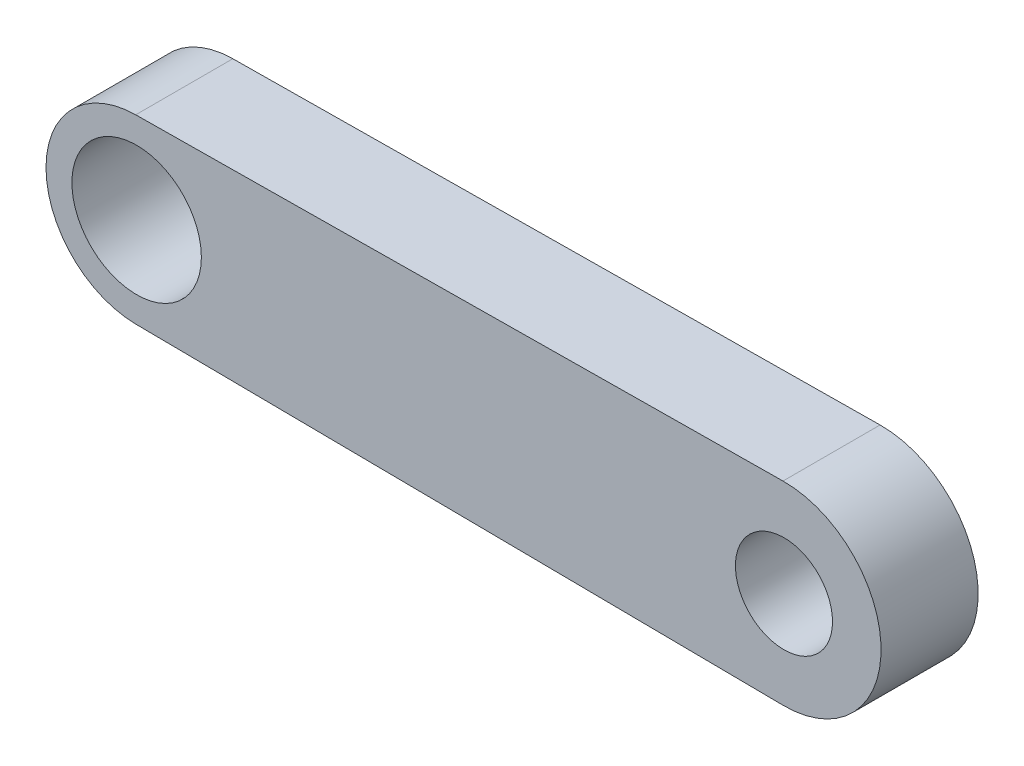
ISO-10303-21;
HEADER;
FILE_DESCRIPTION(('STEP AP214'),'2;1');
FILE_NAME('part.step','',(''),(''),'','','');
FILE_SCHEMA(('AUTOMOTIVE_DESIGN { 1 0 10303 214 1 1 1 1 }'));
ENDSEC;
DATA;
#1=APPLICATION_CONTEXT('core data for automotive mechanical design processes');
#2=APPLICATION_PROTOCOL_DEFINITION('international standard','automotive_design',2000,#1);
#3=PRODUCT_CONTEXT('',#1,'mechanical');
#4=PRODUCT('Part','Part','',(#3));
#5=PRODUCT_RELATED_PRODUCT_CATEGORY('part','',(#4));
#6=PRODUCT_DEFINITION_FORMATION('','',#4);
#7=PRODUCT_DEFINITION_CONTEXT('part definition',#1,'design');
#8=PRODUCT_DEFINITION('design','',#6,#7);
#9=PRODUCT_DEFINITION_SHAPE('','',#8);
#10=(LENGTH_UNIT() NAMED_UNIT(*) SI_UNIT(.MILLI.,.METRE.));
#11=(NAMED_UNIT(*) PLANE_ANGLE_UNIT() SI_UNIT($,.RADIAN.));
#12=(NAMED_UNIT(*) SI_UNIT($,.STERADIAN.) SOLID_ANGLE_UNIT());
#13=UNCERTAINTY_MEASURE_WITH_UNIT(LENGTH_MEASURE(1.E-05),#10,'distance_accuracy_value','');
#14=(GEOMETRIC_REPRESENTATION_CONTEXT(3) GLOBAL_UNCERTAINTY_ASSIGNED_CONTEXT((#13)) GLOBAL_UNIT_ASSIGNED_CONTEXT((#10,
#11,#12)) REPRESENTATION_CONTEXT('',''));
#15=CARTESIAN_POINT('',(0.,0.,0.));
#16=DIRECTION('',(0.,0.,1.));
#17=DIRECTION('',(1.,0.,0.));
#18=AXIS2_PLACEMENT_3D('',#15,#16,#17);
#19=CARTESIAN_POINT('',(20.,0.,3.));
#20=DIRECTION('',(0.,0.,-1.));
#21=DIRECTION('',(-1.,0.,0.));
#22=AXIS2_PLACEMENT_3D('',#19,#20,#21);
#23=CYLINDRICAL_SURFACE('',#22,3.);
#24=CARTESIAN_POINT('',(20.,0.,0.));
#25=DIRECTION('',(0.,0.,1.));
#26=DIRECTION('',(1.,0.,0.));
#27=AXIS2_PLACEMENT_3D('',#24,#25,#26);
#28=CIRCLE('',#27,3.);
#29=CARTESIAN_POINT('',(19.97,2.99984999624981,0.));
#30=VERTEX_POINT('',#29);
#31=CARTESIAN_POINT('',(19.97,-2.99984999624981,0.));
#32=VERTEX_POINT('',#31);
#33=EDGE_CURVE('E107',#30,#32,#28,.F.);
#34=ORIENTED_EDGE('',*,*,#33,.F.);
#35=DIRECTION('',(0.,0.,-1.));
#36=VECTOR('',#35,1.);
#37=CARTESIAN_POINT('',(19.97,2.99984999624981,3.));
#38=LINE('',#37,#36);
#39=CARTESIAN_POINT('',(19.97,2.99984999624981,3.));
#40=VERTEX_POINT('',#39);
#41=EDGE_CURVE('E11',#40,#30,#38,.T.);
#42=ORIENTED_EDGE('',*,*,#41,.F.);
#43=CARTESIAN_POINT('',(20.,0.,3.));
#44=DIRECTION('',(0.,0.,1.));
#45=DIRECTION('',(1.,0.,0.));
#46=AXIS2_PLACEMENT_3D('',#43,#44,#45);
#47=CIRCLE('',#46,3.);
#48=CARTESIAN_POINT('',(19.97,-2.99984999624981,3.));
#49=VERTEX_POINT('',#48);
#50=EDGE_CURVE('E94',#40,#49,#47,.F.);
#51=ORIENTED_EDGE('',*,*,#50,.T.);
#52=DIRECTION('',(0.,0.,-1.));
#53=VECTOR('',#52,1.);
#54=CARTESIAN_POINT('',(19.97,-2.99984999624981,3.));
#55=LINE('',#54,#53);
#56=EDGE_CURVE('E52',#49,#32,#55,.T.);
#57=ORIENTED_EDGE('',*,*,#56,.T.);
#58=EDGE_LOOP('',(#34,#42,#51,#57));
#59=FACE_BOUND('',#58,.T.);
#60=ADVANCED_FACE('F35',(#59),#23,.T.);
#61=CARTESIAN_POINT('',(-0.0279999999999999,2.79985999649983,3.));
#62=DIRECTION('',(-0.00999999999999997,0.999949998749937,0.));
#63=DIRECTION('',(-0.999949998749938,-0.00999999999999998,0.));
#64=AXIS2_PLACEMENT_3D('',#61,#62,#63);
#65=PLANE('',#64);
#66=DIRECTION('',(0.999949998749938,0.00999999999999998,0.));
#67=VECTOR('',#66,1.);
#68=CARTESIAN_POINT('',(-0.0279999999999999,2.79985999649983,0.));
#69=LINE('',#68,#67);
#70=CARTESIAN_POINT('',(-0.028,2.79985999649983,0.));
#71=VERTEX_POINT('',#70);
#72=EDGE_CURVE('E84',#71,#30,#69,.T.);
#73=ORIENTED_EDGE('',*,*,#72,.F.);
#74=DIRECTION('',(0.,0.,-1.));
#75=VECTOR('',#74,1.);
#76=CARTESIAN_POINT('',(-0.028,2.79985999649983,3.));
#77=LINE('',#76,#75);
#78=CARTESIAN_POINT('',(-0.028,2.79985999649983,3.));
#79=VERTEX_POINT('',#78);
#80=EDGE_CURVE('E44',#79,#71,#77,.T.);
#81=ORIENTED_EDGE('',*,*,#80,.F.);
#82=DIRECTION('',(0.999949998749938,0.00999999999999998,0.));
#83=VECTOR('',#82,1.);
#84=CARTESIAN_POINT('',(-0.0279999999999999,2.79985999649983,3.));
#85=LINE('',#84,#83);
#86=EDGE_CURVE('E82',#79,#40,#85,.T.);
#87=ORIENTED_EDGE('',*,*,#86,.T.);
#88=ORIENTED_EDGE('',*,*,#41,.T.);
#89=EDGE_LOOP('',(#73,#81,#87,#88));
#90=FACE_BOUND('',#89,.T.);
#91=ADVANCED_FACE('F80',(#90),#65,.T.);
#92=CARTESIAN_POINT('',(0.,0.,3.));
#93=DIRECTION('',(0.,0.,-1.));
#94=DIRECTION('',(-1.,0.,0.));
#95=AXIS2_PLACEMENT_3D('',#92,#93,#94);
#96=CYLINDRICAL_SURFACE('',#95,2.8);
#97=CARTESIAN_POINT('',(0.,0.,0.));
#98=DIRECTION('',(0.,0.,1.));
#99=DIRECTION('',(1.,0.,0.));
#100=AXIS2_PLACEMENT_3D('',#97,#98,#99);
#101=CIRCLE('',#100,2.8);
#102=CARTESIAN_POINT('',(-0.0279999999999997,-2.79985999649983,0.));
#103=VERTEX_POINT('',#102);
#104=EDGE_CURVE('E110',#71,#103,#101,.T.);
#105=ORIENTED_EDGE('',*,*,#104,.T.);
#106=DIRECTION('',(0.,0.,-1.));
#107=VECTOR('',#106,1.);
#108=CARTESIAN_POINT('',(-0.0279999999999997,-2.79985999649983,3.));
#109=LINE('',#108,#107);
#110=CARTESIAN_POINT('',(-0.0279999999999997,-2.79985999649983,3.));
#111=VERTEX_POINT('',#110);
#112=EDGE_CURVE('E66',#111,#103,#109,.T.);
#113=ORIENTED_EDGE('',*,*,#112,.F.);
#114=CARTESIAN_POINT('',(0.,0.,3.));
#115=DIRECTION('',(0.,0.,1.));
#116=DIRECTION('',(1.,0.,0.));
#117=AXIS2_PLACEMENT_3D('',#114,#115,#116);
#118=CIRCLE('',#117,2.8);
#119=EDGE_CURVE('E87',#79,#111,#118,.T.);
#120=ORIENTED_EDGE('',*,*,#119,.F.);
#121=ORIENTED_EDGE('',*,*,#80,.T.);
#122=EDGE_LOOP('',(#105,#113,#120,#121));
#123=FACE_BOUND('',#122,.T.);
#124=ADVANCED_FACE('F88',(#123),#96,.T.);
#125=CARTESIAN_POINT('',(20.,0.,3.));
#126=DIRECTION('',(0.,0.,-1.));
#127=DIRECTION('',(-1.,0.,0.));
#128=AXIS2_PLACEMENT_3D('',#125,#126,#127);
#129=CYLINDRICAL_SURFACE('',#128,1.5);
#130=CARTESIAN_POINT('',(20.,0.,3.));
#131=DIRECTION('',(0.,0.,1.));
#132=DIRECTION('',(1.,0.,0.));
#133=AXIS2_PLACEMENT_3D('',#130,#131,#132);
#134=CIRCLE('',#133,1.5);
#135=CARTESIAN_POINT('',(21.5,0.,3.));
#136=VERTEX_POINT('',#135);
#137=EDGE_CURVE('E96',#136,#136,#134,.T.);
#138=ORIENTED_EDGE('',*,*,#137,.T.);
#139=EDGE_LOOP('',(#138));
#140=FACE_BOUND('',#139,.T.);
#141=CARTESIAN_POINT('',(20.,0.,0.));
#142=DIRECTION('',(0.,0.,1.));
#143=DIRECTION('',(1.,0.,0.));
#144=AXIS2_PLACEMENT_3D('',#141,#142,#143);
#145=CIRCLE('',#144,1.5);
#146=CARTESIAN_POINT('',(21.5,0.,0.));
#147=VERTEX_POINT('',#146);
#148=EDGE_CURVE('E104',#147,#147,#145,.T.);
#149=ORIENTED_EDGE('',*,*,#148,.F.);
#150=EDGE_LOOP('',(#149));
#151=FACE_BOUND('',#150,.T.);
#152=ADVANCED_FACE('F125',(#140,#151),#129,.F.);
#153=CARTESIAN_POINT('',(0.,0.,3.));
#154=DIRECTION('',(0.,0.,-1.));
#155=DIRECTION('',(-1.,0.,0.));
#156=AXIS2_PLACEMENT_3D('',#153,#154,#155);
#157=CYLINDRICAL_SURFACE('',#156,2.);
#158=CARTESIAN_POINT('',(0.,0.,3.));
#159=DIRECTION('',(0.,0.,1.));
#160=DIRECTION('',(1.,0.,0.));
#161=AXIS2_PLACEMENT_3D('',#158,#159,#160);
#162=CIRCLE('',#161,2.);
#163=CARTESIAN_POINT('',(2.,0.,3.));
#164=VERTEX_POINT('',#163);
#165=EDGE_CURVE('E115',#164,#164,#162,.T.);
#166=ORIENTED_EDGE('',*,*,#165,.T.);
#167=EDGE_LOOP('',(#166));
#168=FACE_BOUND('',#167,.T.);
#169=CARTESIAN_POINT('',(0.,0.,0.));
#170=DIRECTION('',(0.,0.,1.));
#171=DIRECTION('',(1.,0.,0.));
#172=AXIS2_PLACEMENT_3D('',#169,#170,#171);
#173=CIRCLE('',#172,2.);
#174=CARTESIAN_POINT('',(2.,0.,0.));
#175=VERTEX_POINT('',#174);
#176=EDGE_CURVE('E101',#175,#175,#173,.T.);
#177=ORIENTED_EDGE('',*,*,#176,.F.);
#178=EDGE_LOOP('',(#177));
#179=FACE_BOUND('',#178,.T.);
#180=ADVANCED_FACE('F37',(#168,#179),#157,.F.);
#181=CARTESIAN_POINT('',(-0.0279999999999999,-2.79985999649983,3.));
#182=DIRECTION('',(-0.00999999999999997,-0.999949998749937,0.));
#183=DIRECTION('',(0.999949998749938,-0.00999999999999998,0.));
#184=AXIS2_PLACEMENT_3D('',#181,#182,#183);
#185=PLANE('',#184);
#186=DIRECTION('',(-0.999949998749938,0.00999999999999998,0.));
#187=VECTOR('',#186,1.);
#188=CARTESIAN_POINT('',(-0.0279999999999999,-2.79985999649983,0.));
#189=LINE('',#188,#187);
#190=EDGE_CURVE('E112',#32,#103,#189,.T.);
#191=ORIENTED_EDGE('',*,*,#190,.F.);
#192=ORIENTED_EDGE('',*,*,#56,.F.);
#193=DIRECTION('',(-0.999949998749938,0.00999999999999998,0.));
#194=VECTOR('',#193,1.);
#195=CARTESIAN_POINT('',(-0.0279999999999999,-2.79985999649983,3.));
#196=LINE('',#195,#194);
#197=EDGE_CURVE('E91',#49,#111,#196,.T.);
#198=ORIENTED_EDGE('',*,*,#197,.T.);
#199=ORIENTED_EDGE('',*,*,#112,.T.);
#200=EDGE_LOOP('',(#191,#192,#198,#199));
#201=FACE_BOUND('',#200,.T.);
#202=ADVANCED_FACE('F130',(#201),#185,.T.);
#203=CARTESIAN_POINT('',(0.,0.,3.));
#204=DIRECTION('',(0.,0.,1.));
#205=DIRECTION('',(1.,0.,0.));
#206=AXIS2_PLACEMENT_3D('',#203,#204,#205);
#207=PLANE('',#206);
#208=ORIENTED_EDGE('',*,*,#165,.F.);
#209=EDGE_LOOP('',(#208));
#210=FACE_BOUND('',#209,.T.);
#211=ORIENTED_EDGE('',*,*,#137,.F.);
#212=EDGE_LOOP('',(#211));
#213=FACE_BOUND('',#212,.T.);
#214=ORIENTED_EDGE('',*,*,#50,.F.);
#215=ORIENTED_EDGE('',*,*,#86,.F.);
#216=ORIENTED_EDGE('',*,*,#119,.T.);
#217=ORIENTED_EDGE('',*,*,#197,.F.);
#218=EDGE_LOOP('',(#214,#215,#216,#217));
#219=FACE_BOUND('',#218,.T.);
#220=ADVANCED_FACE('F93',(#210,#213,#219),#207,.T.);
#221=CARTESIAN_POINT('',(0.,0.,0.));
#222=DIRECTION('',(0.,0.,1.));
#223=DIRECTION('',(1.,0.,0.));
#224=AXIS2_PLACEMENT_3D('',#221,#222,#223);
#225=PLANE('',#224);
#226=ORIENTED_EDGE('',*,*,#176,.T.);
#227=EDGE_LOOP('',(#226));
#228=FACE_BOUND('',#227,.T.);
#229=ORIENTED_EDGE('',*,*,#148,.T.);
#230=EDGE_LOOP('',(#229));
#231=FACE_BOUND('',#230,.T.);
#232=ORIENTED_EDGE('',*,*,#33,.T.);
#233=ORIENTED_EDGE('',*,*,#190,.T.);
#234=ORIENTED_EDGE('',*,*,#104,.F.);
#235=ORIENTED_EDGE('',*,*,#72,.T.);
#236=EDGE_LOOP('',(#232,#233,#234,#235));
#237=FACE_BOUND('',#236,.T.);
#238=ADVANCED_FACE('F129',(#228,#231,#237),#225,.F.);
#239=CLOSED_SHELL('',(#60,#91,#124,#152,#180,#202,#220,#238));
#240=MANIFOLD_SOLID_BREP('B2',#239);
#241=ADVANCED_BREP_SHAPE_REPRESENTATION('',(#18,#240),#14);
#242=SHAPE_DEFINITION_REPRESENTATION(#9,#241);
ENDSEC;
END-ISO-10303-21;
